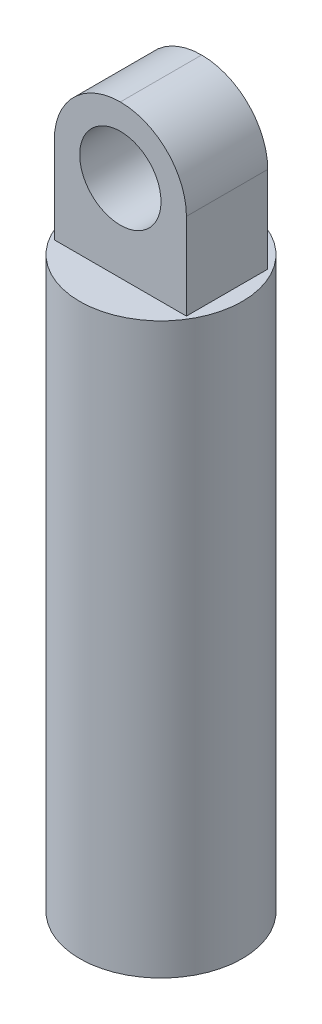
ISO-10303-21;
HEADER;
FILE_DESCRIPTION(('STEP AP214'),'2;1');
FILE_NAME('part.step','',(''),(''),'','','');
FILE_SCHEMA(('AUTOMOTIVE_DESIGN { 1 0 10303 214 1 1 1 1 }'));
ENDSEC;
DATA;
#1=APPLICATION_CONTEXT('core data for automotive mechanical design processes');
#2=APPLICATION_PROTOCOL_DEFINITION('international standard','automotive_design',2000,#1);
#3=PRODUCT_CONTEXT('',#1,'mechanical');
#4=PRODUCT('Part','Part','',(#3));
#5=PRODUCT_RELATED_PRODUCT_CATEGORY('part','',(#4));
#6=PRODUCT_DEFINITION_FORMATION('','',#4);
#7=PRODUCT_DEFINITION_CONTEXT('part definition',#1,'design');
#8=PRODUCT_DEFINITION('design','',#6,#7);
#9=PRODUCT_DEFINITION_SHAPE('','',#8);
#10=(LENGTH_UNIT() NAMED_UNIT(*) SI_UNIT(.MILLI.,.METRE.));
#11=(NAMED_UNIT(*) PLANE_ANGLE_UNIT() SI_UNIT($,.RADIAN.));
#12=(NAMED_UNIT(*) SI_UNIT($,.STERADIAN.) SOLID_ANGLE_UNIT());
#13=UNCERTAINTY_MEASURE_WITH_UNIT(LENGTH_MEASURE(1.E-05),#10,'distance_accuracy_value','');
#14=(GEOMETRIC_REPRESENTATION_CONTEXT(3) GLOBAL_UNCERTAINTY_ASSIGNED_CONTEXT((#13)) GLOBAL_UNIT_ASSIGNED_CONTEXT((#10,
#11,#12)) REPRESENTATION_CONTEXT('',''));
#15=CARTESIAN_POINT('',(0.,0.,0.));
#16=DIRECTION('',(0.,0.,1.));
#17=DIRECTION('',(1.,0.,0.));
#18=AXIS2_PLACEMENT_3D('',#15,#16,#17);
#19=CARTESIAN_POINT('',(0.,88.9,0.));
#20=DIRECTION('',(0.,1.,0.));
#21=DIRECTION('',(0.,0.,1.));
#22=AXIS2_PLACEMENT_3D('',#19,#20,#21);
#23=PLANE('',#22);
#24=CARTESIAN_POINT('',(0.,88.9,0.));
#25=DIRECTION('',(0.,1.,0.));
#26=DIRECTION('',(0.,0.,1.));
#27=AXIS2_PLACEMENT_3D('',#24,#25,#26);
#28=CIRCLE('',#27,12.7);
#29=CARTESIAN_POINT('',(0.,88.9,12.7));
#30=VERTEX_POINT('',#29);
#31=EDGE_CURVE('E104',#30,#30,#28,.T.);
#32=ORIENTED_EDGE('',*,*,#31,.T.);
#33=EDGE_LOOP('',(#32));
#34=FACE_BOUND('',#33,.T.);
#35=DIRECTION('',(-1.,0.,0.));
#36=VECTOR('',#35,1.);
#37=CARTESIAN_POINT('',(10.31875,88.9,-6.35));
#38=LINE('',#37,#36);
#39=CARTESIAN_POINT('',(10.31875,88.9,-6.35));
#40=VERTEX_POINT('',#39);
#41=CARTESIAN_POINT('',(-10.31875,88.9,-6.35));
#42=VERTEX_POINT('',#41);
#43=EDGE_CURVE('E76',#40,#42,#38,.T.);
#44=ORIENTED_EDGE('',*,*,#43,.F.);
#45=DIRECTION('',(0.,0.,-1.));
#46=VECTOR('',#45,1.);
#47=CARTESIAN_POINT('',(10.31875,88.9,6.35));
#48=LINE('',#47,#46);
#49=CARTESIAN_POINT('',(10.31875,88.9,6.35));
#50=VERTEX_POINT('',#49);
#51=EDGE_CURVE('E84',#50,#40,#48,.T.);
#52=ORIENTED_EDGE('',*,*,#51,.F.);
#53=DIRECTION('',(1.,0.,0.));
#54=VECTOR('',#53,1.);
#55=CARTESIAN_POINT('',(10.31875,88.9,6.35));
#56=LINE('',#55,#54);
#57=CARTESIAN_POINT('',(-10.31875,88.9,6.35));
#58=VERTEX_POINT('',#57);
#59=EDGE_CURVE('E95',#58,#50,#56,.T.);
#60=ORIENTED_EDGE('',*,*,#59,.F.);
#61=DIRECTION('',(0.,0.,1.));
#62=VECTOR('',#61,1.);
#63=CARTESIAN_POINT('',(-10.31875,88.9,6.35));
#64=LINE('',#63,#62);
#65=EDGE_CURVE('E93',#42,#58,#64,.T.);
#66=ORIENTED_EDGE('',*,*,#65,.F.);
#67=EDGE_LOOP('',(#44,#52,#60,#66));
#68=FACE_BOUND('',#67,.T.);
#69=ADVANCED_FACE('F30',(#34,#68),#23,.T.);
#70=CARTESIAN_POINT('',(0.,88.9,0.));
#71=DIRECTION('',(0.,-1.,0.));
#72=DIRECTION('',(0.,0.,-1.));
#73=AXIS2_PLACEMENT_3D('',#70,#71,#72);
#74=CYLINDRICAL_SURFACE('',#73,12.7);
#75=ORIENTED_EDGE('',*,*,#31,.F.);
#76=EDGE_LOOP('',(#75));
#77=FACE_BOUND('',#76,.T.);
#78=CARTESIAN_POINT('',(0.,0.,0.));
#79=DIRECTION('',(0.,1.,0.));
#80=DIRECTION('',(0.,0.,1.));
#81=AXIS2_PLACEMENT_3D('',#78,#79,#80);
#82=CIRCLE('',#81,12.7);
#83=CARTESIAN_POINT('',(0.,0.,12.7));
#84=VERTEX_POINT('',#83);
#85=EDGE_CURVE('E80',#84,#84,#82,.T.);
#86=ORIENTED_EDGE('',*,*,#85,.T.);
#87=EDGE_LOOP('',(#86));
#88=FACE_BOUND('',#87,.T.);
#89=ADVANCED_FACE('F149',(#77,#88),#74,.T.);
#90=CARTESIAN_POINT('',(0.,0.,0.));
#91=DIRECTION('',(0.,1.,0.));
#92=DIRECTION('',(0.,0.,1.));
#93=AXIS2_PLACEMENT_3D('',#90,#91,#92);
#94=PLANE('',#93);
#95=ORIENTED_EDGE('',*,*,#85,.F.);
#96=EDGE_LOOP('',(#95));
#97=FACE_BOUND('',#96,.T.);
#98=ADVANCED_FACE('F155',(#97),#94,.F.);
#99=CARTESIAN_POINT('',(10.31875,112.7125,6.35));
#100=DIRECTION('',(-1.,0.,0.));
#101=DIRECTION('',(0.,0.,1.));
#102=AXIS2_PLACEMENT_3D('',#99,#100,#101);
#103=PLANE('',#102);
#104=DIRECTION('',(0.,-1.,0.));
#105=VECTOR('',#104,1.);
#106=CARTESIAN_POINT('',(10.31875,112.7125,-6.35));
#107=LINE('',#106,#105);
#108=CARTESIAN_POINT('',(10.31875,102.39375,-6.35));
#109=VERTEX_POINT('',#108);
#110=EDGE_CURVE('E72',#109,#40,#107,.T.);
#111=ORIENTED_EDGE('',*,*,#110,.F.);
#112=DIRECTION('',(0.,0.,-1.));
#113=VECTOR('',#112,1.);
#114=CARTESIAN_POINT('',(10.31875,102.39375,6.35));
#115=LINE('',#114,#113);
#116=CARTESIAN_POINT('',(10.31875,102.39375,6.35));
#117=VERTEX_POINT('',#116);
#118=EDGE_CURVE('E11',#109,#117,#115,.F.);
#119=ORIENTED_EDGE('',*,*,#118,.T.);
#120=DIRECTION('',(0.,-1.,0.));
#121=VECTOR('',#120,1.);
#122=CARTESIAN_POINT('',(10.31875,112.7125,6.35));
#123=LINE('',#122,#121);
#124=EDGE_CURVE('E87',#117,#50,#123,.T.);
#125=ORIENTED_EDGE('',*,*,#124,.T.);
#126=ORIENTED_EDGE('',*,*,#51,.T.);
#127=EDGE_LOOP('',(#111,#119,#125,#126));
#128=FACE_BOUND('',#127,.T.);
#129=ADVANCED_FACE('F85',(#128),#103,.F.);
#130=CARTESIAN_POINT('',(10.31875,112.7125,-6.35));
#131=DIRECTION('',(0.,0.,1.));
#132=DIRECTION('',(1.,0.,0.));
#133=AXIS2_PLACEMENT_3D('',#130,#131,#132);
#134=PLANE('',#133);
#135=CARTESIAN_POINT('',(0.,102.39375,-6.35));
#136=DIRECTION('',(0.,0.,1.));
#137=DIRECTION('',(1.,0.,0.));
#138=AXIS2_PLACEMENT_3D('',#135,#136,#137);
#139=CIRCLE('',#138,6.34999999999999);
#140=CARTESIAN_POINT('',(6.34999999999999,102.39375,-6.35));
#141=VERTEX_POINT('',#140);
#142=EDGE_CURVE('E128',#141,#141,#139,.T.);
#143=ORIENTED_EDGE('',*,*,#142,.T.);
#144=EDGE_LOOP('',(#143));
#145=FACE_BOUND('',#144,.T.);
#146=DIRECTION('',(0.,-1.,0.));
#147=VECTOR('',#146,1.);
#148=CARTESIAN_POINT('',(-10.31875,112.7125,-6.35));
#149=LINE('',#148,#147);
#150=CARTESIAN_POINT('',(-10.31875,102.39375,-6.35));
#151=VERTEX_POINT('',#150);
#152=EDGE_CURVE('E81',#151,#42,#149,.T.);
#153=ORIENTED_EDGE('',*,*,#152,.F.);
#154=CARTESIAN_POINT('',(0.,102.39375,-6.35));
#155=DIRECTION('',(0.,0.,1.));
#156=DIRECTION('',(1.,0.,0.));
#157=AXIS2_PLACEMENT_3D('',#154,#155,#156);
#158=CIRCLE('',#157,10.31875);
#159=CARTESIAN_POINT('',(0.,112.7125,-6.35));
#160=VERTEX_POINT('',#159);
#161=EDGE_CURVE('E39',#151,#160,#158,.F.);
#162=ORIENTED_EDGE('',*,*,#161,.T.);
#163=CARTESIAN_POINT('',(0.,102.39375,-6.35));
#164=DIRECTION('',(0.,0.,1.));
#165=DIRECTION('',(1.,0.,0.));
#166=AXIS2_PLACEMENT_3D('',#163,#164,#165);
#167=CIRCLE('',#166,10.31875);
#168=EDGE_CURVE('E46',#160,#109,#167,.F.);
#169=ORIENTED_EDGE('',*,*,#168,.T.);
#170=ORIENTED_EDGE('',*,*,#110,.T.);
#171=ORIENTED_EDGE('',*,*,#43,.T.);
#172=EDGE_LOOP('',(#153,#162,#169,#170,#171));
#173=FACE_BOUND('',#172,.T.);
#174=ADVANCED_FACE('F74',(#145,#173),#134,.F.);
#175=CARTESIAN_POINT('',(-10.31875,112.7125,6.35));
#176=DIRECTION('',(1.,0.,0.));
#177=DIRECTION('',(0.,0.,-1.));
#178=AXIS2_PLACEMENT_3D('',#175,#176,#177);
#179=PLANE('',#178);
#180=DIRECTION('',(0.,-1.,0.));
#181=VECTOR('',#180,1.);
#182=CARTESIAN_POINT('',(-10.31875,112.7125,6.35));
#183=LINE('',#182,#181);
#184=CARTESIAN_POINT('',(-10.31875,102.39375,6.35));
#185=VERTEX_POINT('',#184);
#186=EDGE_CURVE('E101',#185,#58,#183,.T.);
#187=ORIENTED_EDGE('',*,*,#186,.F.);
#188=DIRECTION('',(0.,0.,1.));
#189=VECTOR('',#188,1.);
#190=CARTESIAN_POINT('',(-10.31875,102.39375,-6.35));
#191=LINE('',#190,#189);
#192=EDGE_CURVE('E113',#185,#151,#191,.F.);
#193=ORIENTED_EDGE('',*,*,#192,.T.);
#194=ORIENTED_EDGE('',*,*,#152,.T.);
#195=ORIENTED_EDGE('',*,*,#65,.T.);
#196=EDGE_LOOP('',(#187,#193,#194,#195));
#197=FACE_BOUND('',#196,.T.);
#198=ADVANCED_FACE('F120',(#197),#179,.F.);
#199=CARTESIAN_POINT('',(10.31875,112.7125,6.35));
#200=DIRECTION('',(0.,0.,-1.));
#201=DIRECTION('',(-1.,0.,0.));
#202=AXIS2_PLACEMENT_3D('',#199,#200,#201);
#203=PLANE('',#202);
#204=CARTESIAN_POINT('',(0.,102.39375,6.35));
#205=DIRECTION('',(0.,0.,1.));
#206=DIRECTION('',(1.,0.,0.));
#207=AXIS2_PLACEMENT_3D('',#204,#205,#206);
#208=CIRCLE('',#207,6.34999999999999);
#209=CARTESIAN_POINT('',(6.34999999999999,102.39375,6.35));
#210=VERTEX_POINT('',#209);
#211=EDGE_CURVE('E130',#210,#210,#208,.T.);
#212=ORIENTED_EDGE('',*,*,#211,.F.);
#213=EDGE_LOOP('',(#212));
#214=FACE_BOUND('',#213,.T.);
#215=CARTESIAN_POINT('',(0.,102.39375,6.35));
#216=DIRECTION('',(0.,0.,-1.));
#217=DIRECTION('',(-1.,0.,0.));
#218=AXIS2_PLACEMENT_3D('',#215,#216,#217);
#219=CIRCLE('',#218,10.31875);
#220=CARTESIAN_POINT('',(0.,112.7125,6.35));
#221=VERTEX_POINT('',#220);
#222=EDGE_CURVE('E107',#117,#221,#219,.F.);
#223=ORIENTED_EDGE('',*,*,#222,.T.);
#224=CARTESIAN_POINT('',(0.,102.39375,6.35));
#225=DIRECTION('',(0.,0.,-1.));
#226=DIRECTION('',(-1.,0.,0.));
#227=AXIS2_PLACEMENT_3D('',#224,#225,#226);
#228=CIRCLE('',#227,10.31875);
#229=EDGE_CURVE('E111',#221,#185,#228,.F.);
#230=ORIENTED_EDGE('',*,*,#229,.T.);
#231=ORIENTED_EDGE('',*,*,#186,.T.);
#232=ORIENTED_EDGE('',*,*,#59,.T.);
#233=ORIENTED_EDGE('',*,*,#124,.F.);
#234=EDGE_LOOP('',(#223,#230,#231,#232,#233));
#235=FACE_BOUND('',#234,.T.);
#236=ADVANCED_FACE('F140',(#214,#235),#203,.F.);
#237=CARTESIAN_POINT('',(0.,102.39375,-6.35));
#238=DIRECTION('',(0.,0.,1.));
#239=DIRECTION('',(1.,0.,0.));
#240=AXIS2_PLACEMENT_3D('',#237,#238,#239);
#241=CYLINDRICAL_SURFACE('',#240,10.31875);
#242=ORIENTED_EDGE('',*,*,#118,.F.);
#243=ORIENTED_EDGE('',*,*,#168,.F.);
#244=DIRECTION('',(0.,0.,-1.));
#245=VECTOR('',#244,1.);
#246=CARTESIAN_POINT('',(0.,112.7125,-6.35));
#247=LINE('',#246,#245);
#248=EDGE_CURVE('E34',#221,#160,#247,.T.);
#249=ORIENTED_EDGE('',*,*,#248,.F.);
#250=ORIENTED_EDGE('',*,*,#222,.F.);
#251=EDGE_LOOP('',(#242,#243,#249,#250));
#252=FACE_BOUND('',#251,.T.);
#253=ADVANCED_FACE('F32',(#252),#241,.T.);
#254=CARTESIAN_POINT('',(0.,102.39375,-6.35));
#255=DIRECTION('',(0.,0.,-1.));
#256=DIRECTION('',(-1.,0.,0.));
#257=AXIS2_PLACEMENT_3D('',#254,#255,#256);
#258=CYLINDRICAL_SURFACE('',#257,10.31875);
#259=ORIENTED_EDGE('',*,*,#161,.F.);
#260=ORIENTED_EDGE('',*,*,#192,.F.);
#261=ORIENTED_EDGE('',*,*,#229,.F.);
#262=ORIENTED_EDGE('',*,*,#248,.T.);
#263=EDGE_LOOP('',(#259,#260,#261,#262));
#264=FACE_BOUND('',#263,.T.);
#265=ADVANCED_FACE('F123',(#264),#258,.T.);
#266=CARTESIAN_POINT('',(0.,102.39375,-12.7));
#267=DIRECTION('',(0.,0.,1.));
#268=DIRECTION('',(1.,0.,0.));
#269=AXIS2_PLACEMENT_3D('',#266,#267,#268);
#270=CYLINDRICAL_SURFACE('',#269,6.34999999999999);
#271=ORIENTED_EDGE('',*,*,#211,.T.);
#272=EDGE_LOOP('',(#271));
#273=FACE_BOUND('',#272,.T.);
#274=ORIENTED_EDGE('',*,*,#142,.F.);
#275=EDGE_LOOP('',(#274));
#276=FACE_BOUND('',#275,.T.);
#277=ADVANCED_FACE('F137',(#273,#276),#270,.F.);
#278=CLOSED_SHELL('',(#69,#89,#98,#129,#174,#198,#236,#253,#265,#277));
#279=MANIFOLD_SOLID_BREP('B2',#278);
#280=ADVANCED_BREP_SHAPE_REPRESENTATION('',(#18,#279),#14);
#281=SHAPE_DEFINITION_REPRESENTATION(#9,#280);
ENDSEC;
END-ISO-10303-21;
